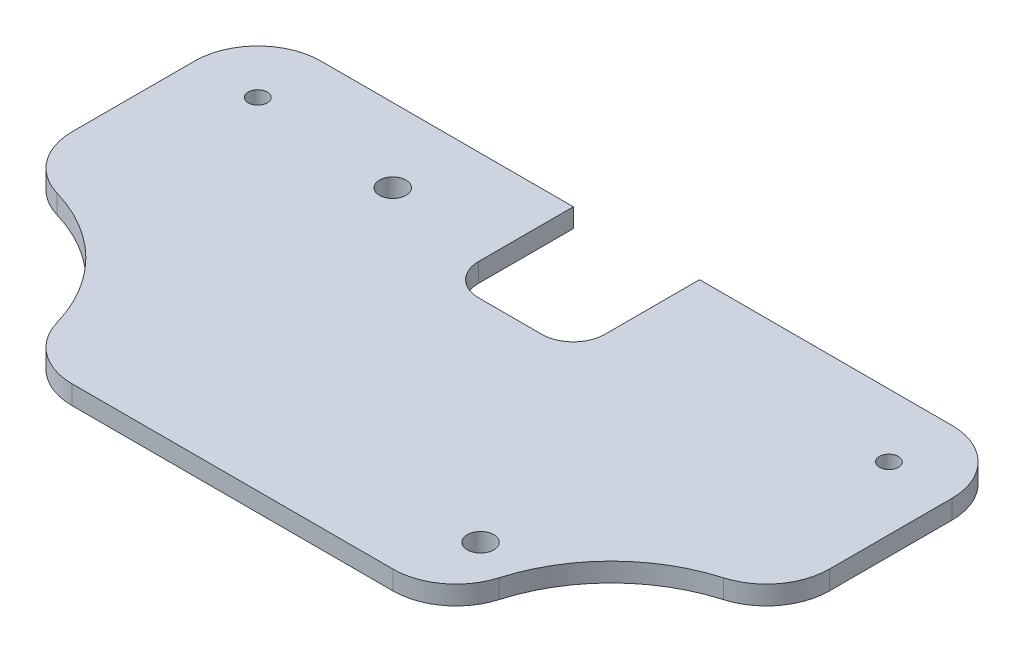
ISO-10303-21;
HEADER;
FILE_DESCRIPTION(('STEP AP214'),'2;1');
FILE_NAME('part.step','',(''),(''),'','','');
FILE_SCHEMA(('AUTOMOTIVE_DESIGN { 1 0 10303 214 1 1 1 1 }'));
ENDSEC;
DATA;
#1=APPLICATION_CONTEXT('core data for automotive mechanical design processes');
#2=APPLICATION_PROTOCOL_DEFINITION('international standard','automotive_design',2000,#1);
#3=PRODUCT_CONTEXT('',#1,'mechanical');
#4=PRODUCT('Part','Part','',(#3));
#5=PRODUCT_RELATED_PRODUCT_CATEGORY('part','',(#4));
#6=PRODUCT_DEFINITION_FORMATION('','',#4);
#7=PRODUCT_DEFINITION_CONTEXT('part definition',#1,'design');
#8=PRODUCT_DEFINITION('design','',#6,#7);
#9=PRODUCT_DEFINITION_SHAPE('','',#8);
#10=(LENGTH_UNIT() NAMED_UNIT(*) SI_UNIT(.MILLI.,.METRE.));
#11=(NAMED_UNIT(*) PLANE_ANGLE_UNIT() SI_UNIT($,.RADIAN.));
#12=(NAMED_UNIT(*) SI_UNIT($,.STERADIAN.) SOLID_ANGLE_UNIT());
#13=UNCERTAINTY_MEASURE_WITH_UNIT(LENGTH_MEASURE(1.E-05),#10,'distance_accuracy_value','');
#14=(GEOMETRIC_REPRESENTATION_CONTEXT(3) GLOBAL_UNCERTAINTY_ASSIGNED_CONTEXT((#13)) GLOBAL_UNIT_ASSIGNED_CONTEXT((#10,
#11,#12)) REPRESENTATION_CONTEXT('',''));
#15=CARTESIAN_POINT('',(0.,0.,0.));
#16=DIRECTION('',(0.,0.,1.));
#17=DIRECTION('',(1.,0.,0.));
#18=AXIS2_PLACEMENT_3D('',#15,#16,#17);
#19=CARTESIAN_POINT('',(-60.,3.,-32.));
#20=DIRECTION('',(0.,0.,1.));
#21=DIRECTION('',(1.,0.,0.));
#22=AXIS2_PLACEMENT_3D('',#19,#20,#21);
#23=PLANE('',#22);
#24=DIRECTION('',(-1.,0.,0.));
#25=VECTOR('',#24,1.);
#26=CARTESIAN_POINT('',(-60.,3.,-32.));
#27=LINE('',#26,#25);
#28=CARTESIAN_POINT('',(-9.99999999999999,3.,-32.));
#29=VERTEX_POINT('',#28);
#30=CARTESIAN_POINT('',(-50.,3.,-32.));
#31=VERTEX_POINT('',#30);
#32=EDGE_CURVE('E166',#29,#31,#27,.T.);
#33=ORIENTED_EDGE('',*,*,#32,.F.);
#34=DIRECTION('',(0.,-1.,0.));
#35=VECTOR('',#34,1.);
#36=CARTESIAN_POINT('',(-9.99999999999999,3.,-32.));
#37=LINE('',#36,#35);
#38=CARTESIAN_POINT('',(-9.99999999999999,0.,-32.));
#39=VERTEX_POINT('',#38);
#40=EDGE_CURVE('E178',#29,#39,#37,.T.);
#41=ORIENTED_EDGE('',*,*,#40,.T.);
#42=DIRECTION('',(-1.,0.,0.));
#43=VECTOR('',#42,1.);
#44=CARTESIAN_POINT('',(-60.,0.,-32.));
#45=LINE('',#44,#43);
#46=CARTESIAN_POINT('',(-50.,0.,-32.));
#47=VERTEX_POINT('',#46);
#48=EDGE_CURVE('E205',#39,#47,#45,.T.);
#49=ORIENTED_EDGE('',*,*,#48,.T.);
#50=DIRECTION('',(0.,-1.,0.));
#51=VECTOR('',#50,1.);
#52=CARTESIAN_POINT('',(-50.,3.,-32.));
#53=LINE('',#52,#51);
#54=EDGE_CURVE('E188',#47,#31,#53,.F.);
#55=ORIENTED_EDGE('',*,*,#54,.T.);
#56=EDGE_LOOP('',(#33,#41,#49,#55));
#57=FACE_BOUND('',#56,.T.);
#58=ADVANCED_FACE('F34',(#57),#23,.F.);
#59=CARTESIAN_POINT('',(60.,3.,32.));
#60=DIRECTION('',(-1.,0.,0.));
#61=DIRECTION('',(0.,0.,1.));
#62=AXIS2_PLACEMENT_3D('',#59,#60,#61);
#63=PLANE('',#62);
#64=DIRECTION('',(0.,0.,-1.));
#65=VECTOR('',#64,1.);
#66=CARTESIAN_POINT('',(60.,3.,32.));
#67=LINE('',#66,#65);
#68=CARTESIAN_POINT('',(60.,3.,-2.58323293158116));
#69=VERTEX_POINT('',#68);
#70=CARTESIAN_POINT('',(60.,3.,-22.));
#71=VERTEX_POINT('',#70);
#72=EDGE_CURVE('E191',#69,#71,#67,.T.);
#73=ORIENTED_EDGE('',*,*,#72,.F.);
#74=DIRECTION('',(0.,-1.,0.));
#75=VECTOR('',#74,1.);
#76=CARTESIAN_POINT('',(60.,3.,-2.58323293158116));
#77=LINE('',#76,#75);
#78=CARTESIAN_POINT('',(60.,0.,-2.58323293158116));
#79=VERTEX_POINT('',#78);
#80=EDGE_CURVE('E251',#69,#79,#77,.T.);
#81=ORIENTED_EDGE('',*,*,#80,.T.);
#82=DIRECTION('',(0.,0.,-1.));
#83=VECTOR('',#82,1.);
#84=CARTESIAN_POINT('',(60.,0.,32.));
#85=LINE('',#84,#83);
#86=CARTESIAN_POINT('',(60.,0.,-22.));
#87=VERTEX_POINT('',#86);
#88=EDGE_CURVE('E203',#79,#87,#85,.T.);
#89=ORIENTED_EDGE('',*,*,#88,.T.);
#90=DIRECTION('',(0.,-1.,0.));
#91=VECTOR('',#90,1.);
#92=CARTESIAN_POINT('',(60.,3.,-22.));
#93=LINE('',#92,#91);
#94=EDGE_CURVE('E225',#87,#71,#93,.F.);
#95=ORIENTED_EDGE('',*,*,#94,.T.);
#96=EDGE_LOOP('',(#73,#81,#89,#95));
#97=FACE_BOUND('',#96,.T.);
#98=ADVANCED_FACE('F347',(#97),#63,.F.);
#99=CARTESIAN_POINT('',(50.,0.,-32.));
#100=VERTEX_POINT('',#99);
#101=CARTESIAN_POINT('',(10.,0.,-32.));
#102=VERTEX_POINT('',#101);
#103=EDGE_CURVE('E207',#100,#102,#45,.T.);
#104=ORIENTED_EDGE('',*,*,#103,.T.);
#105=DIRECTION('',(0.,-1.,0.));
#106=VECTOR('',#105,1.);
#107=CARTESIAN_POINT('',(10.,3.,-32.));
#108=LINE('',#107,#106);
#109=CARTESIAN_POINT('',(10.,3.,-32.));
#110=VERTEX_POINT('',#109);
#111=EDGE_CURVE('E184',#110,#102,#108,.T.);
#112=ORIENTED_EDGE('',*,*,#111,.F.);
#113=CARTESIAN_POINT('',(50.,3.,-32.));
#114=VERTEX_POINT('',#113);
#115=EDGE_CURVE('E190',#114,#110,#27,.T.);
#116=ORIENTED_EDGE('',*,*,#115,.F.);
#117=DIRECTION('',(0.,-1.,0.));
#118=VECTOR('',#117,1.);
#119=CARTESIAN_POINT('',(50.,3.,-32.));
#120=LINE('',#119,#118);
#121=EDGE_CURVE('E216',#114,#100,#120,.T.);
#122=ORIENTED_EDGE('',*,*,#121,.T.);
#123=EDGE_LOOP('',(#104,#112,#116,#122));
#124=FACE_BOUND('',#123,.T.);
#125=ADVANCED_FACE('F349',(#124),#23,.F.);
#126=CARTESIAN_POINT('',(-60.,3.,32.));
#127=DIRECTION('',(1.,0.,0.));
#128=DIRECTION('',(0.,0.,-1.));
#129=AXIS2_PLACEMENT_3D('',#126,#127,#128);
#130=PLANE('',#129);
#131=DIRECTION('',(0.,0.,1.));
#132=VECTOR('',#131,1.);
#133=CARTESIAN_POINT('',(-60.,0.,32.));
#134=LINE('',#133,#132);
#135=CARTESIAN_POINT('',(-60.,0.,-22.));
#136=VERTEX_POINT('',#135);
#137=CARTESIAN_POINT('',(-60.,0.,-2.58323293158116));
#138=VERTEX_POINT('',#137);
#139=EDGE_CURVE('E210',#136,#138,#134,.T.);
#140=ORIENTED_EDGE('',*,*,#139,.T.);
#141=DIRECTION('',(0.,-1.,0.));
#142=VECTOR('',#141,1.);
#143=CARTESIAN_POINT('',(-60.,3.,-2.58323293158116));
#144=LINE('',#143,#142);
#145=CARTESIAN_POINT('',(-60.,3.,-2.58323293158116));
#146=VERTEX_POINT('',#145);
#147=EDGE_CURVE('E266',#138,#146,#144,.F.);
#148=ORIENTED_EDGE('',*,*,#147,.T.);
#149=DIRECTION('',(0.,0.,1.));
#150=VECTOR('',#149,1.);
#151=CARTESIAN_POINT('',(-60.,3.,32.));
#152=LINE('',#151,#150);
#153=CARTESIAN_POINT('',(-60.,3.,-22.));
#154=VERTEX_POINT('',#153);
#155=EDGE_CURVE('E194',#154,#146,#152,.T.);
#156=ORIENTED_EDGE('',*,*,#155,.F.);
#157=DIRECTION('',(0.,-1.,0.));
#158=VECTOR('',#157,1.);
#159=CARTESIAN_POINT('',(-60.,3.,-22.));
#160=LINE('',#159,#158);
#161=EDGE_CURVE('E232',#154,#136,#160,.T.);
#162=ORIENTED_EDGE('',*,*,#161,.T.);
#163=EDGE_LOOP('',(#140,#148,#156,#162));
#164=FACE_BOUND('',#163,.T.);
#165=ADVANCED_FACE('F341',(#164),#130,.F.);
#166=CARTESIAN_POINT('',(-60.,3.,32.));
#167=DIRECTION('',(0.,0.,-1.));
#168=DIRECTION('',(-1.,0.,0.));
#169=AXIS2_PLACEMENT_3D('',#166,#167,#168);
#170=PLANE('',#169);
#171=DIRECTION('',(1.,0.,0.));
#172=VECTOR('',#171,1.);
#173=CARTESIAN_POINT('',(-60.,0.,32.));
#174=LINE('',#173,#172);
#175=CARTESIAN_POINT('',(-25.4167670684188,0.,32.));
#176=VERTEX_POINT('',#175);
#177=CARTESIAN_POINT('',(25.4167670684188,0.,32.));
#178=VERTEX_POINT('',#177);
#179=EDGE_CURVE('E195',#176,#178,#174,.T.);
#180=ORIENTED_EDGE('',*,*,#179,.T.);
#181=DIRECTION('',(0.,-1.,0.));
#182=VECTOR('',#181,1.);
#183=CARTESIAN_POINT('',(25.4167670684188,3.,32.));
#184=LINE('',#183,#182);
#185=CARTESIAN_POINT('',(25.4167670684188,3.,32.));
#186=VERTEX_POINT('',#185);
#187=EDGE_CURVE('E274',#178,#186,#184,.F.);
#188=ORIENTED_EDGE('',*,*,#187,.T.);
#189=DIRECTION('',(1.,0.,0.));
#190=VECTOR('',#189,1.);
#191=CARTESIAN_POINT('',(-60.,3.,32.));
#192=LINE('',#191,#190);
#193=CARTESIAN_POINT('',(-25.4167670684188,3.,32.));
#194=VERTEX_POINT('',#193);
#195=EDGE_CURVE('E201',#194,#186,#192,.T.);
#196=ORIENTED_EDGE('',*,*,#195,.F.);
#197=DIRECTION('',(0.,-1.,0.));
#198=VECTOR('',#197,1.);
#199=CARTESIAN_POINT('',(-25.4167670684188,3.,32.));
#200=LINE('',#199,#198);
#201=EDGE_CURVE('E271',#194,#176,#200,.T.);
#202=ORIENTED_EDGE('',*,*,#201,.T.);
#203=EDGE_LOOP('',(#180,#188,#196,#202));
#204=FACE_BOUND('',#203,.T.);
#205=ADVANCED_FACE('F331',(#204),#170,.F.);
#206=CARTESIAN_POINT('',(0.,3.,0.));
#207=DIRECTION('',(0.,-1.,0.));
#208=DIRECTION('',(0.,0.,-1.));
#209=AXIS2_PLACEMENT_3D('',#206,#207,#208);
#210=PLANE('',#209);
#211=CARTESIAN_POINT('',(-26.921391454817,3.,-20.3095932567179));
#212=DIRECTION('',(0.,1.,0.));
#213=DIRECTION('',(0.,0.,1.));
#214=AXIS2_PLACEMENT_3D('',#211,#212,#213);
#215=CIRCLE('',#214,2.09999999999999);
#216=CARTESIAN_POINT('',(-26.921391454817,3.,-18.2095932567179));
#217=VERTEX_POINT('',#216);
#218=EDGE_CURVE('E285',#217,#217,#215,.T.);
#219=ORIENTED_EDGE('',*,*,#218,.F.);
#220=EDGE_LOOP('',(#219));
#221=FACE_BOUND('',#220,.T.);
#222=CARTESIAN_POINT('',(28.6833041627338,3.,21.3841451853975));
#223=DIRECTION('',(0.,1.,0.));
#224=DIRECTION('',(0.,0.,1.));
#225=AXIS2_PLACEMENT_3D('',#222,#223,#224);
#226=CIRCLE('',#225,2.09999999999999);
#227=CARTESIAN_POINT('',(28.6833041627338,3.,23.4841451853975));
#228=VERTEX_POINT('',#227);
#229=EDGE_CURVE('E291',#228,#228,#226,.T.);
#230=ORIENTED_EDGE('',*,*,#229,.F.);
#231=EDGE_LOOP('',(#230));
#232=FACE_BOUND('',#231,.T.);
#233=CARTESIAN_POINT('',(-50.,3.,-22.));
#234=DIRECTION('',(0.,1.,0.));
#235=DIRECTION('',(0.,0.,1.));
#236=AXIS2_PLACEMENT_3D('',#233,#234,#235);
#237=CIRCLE('',#236,1.5);
#238=CARTESIAN_POINT('',(-50.,3.,-20.5));
#239=VERTEX_POINT('',#238);
#240=EDGE_CURVE('E319',#239,#239,#237,.T.);
#241=ORIENTED_EDGE('',*,*,#240,.F.);
#242=EDGE_LOOP('',(#241));
#243=FACE_BOUND('',#242,.T.);
#244=CARTESIAN_POINT('',(50.,3.,-22.));
#245=DIRECTION('',(0.,1.,0.));
#246=DIRECTION('',(0.,0.,-1.));
#247=AXIS2_PLACEMENT_3D('',#244,#245,#246);
#248=CIRCLE('',#247,1.5);
#249=CARTESIAN_POINT('',(50.,3.,-23.5));
#250=VERTEX_POINT('',#249);
#251=EDGE_CURVE('E315',#250,#250,#248,.T.);
#252=ORIENTED_EDGE('',*,*,#251,.F.);
#253=EDGE_LOOP('',(#252));
#254=FACE_BOUND('',#253,.T.);
#255=ORIENTED_EDGE('',*,*,#195,.T.);
#256=CARTESIAN_POINT('',(25.4167670684188,3.,22.));
#257=DIRECTION('',(0.,-1.,0.));
#258=DIRECTION('',(0.,0.,-1.));
#259=AXIS2_PLACEMENT_3D('',#256,#257,#258);
#260=CIRCLE('',#259,10.);
#261=CARTESIAN_POINT('',(35.0232206605247,3.,24.7777777777778));
#262=VERTEX_POINT('',#261);
#263=EDGE_CURVE('E279',#186,#262,#260,.F.);
#264=ORIENTED_EDGE('',*,*,#263,.T.);
#265=CARTESIAN_POINT('',(60.,3.,32.));
#266=DIRECTION('',(0.,-1.,0.));
#267=DIRECTION('',(0.,0.,1.));
#268=AXIS2_PLACEMENT_3D('',#265,#266,#267);
#269=CIRCLE('',#268,26.);
#270=CARTESIAN_POINT('',(52.7777777777778,3.,7.02322066052472));
#271=VERTEX_POINT('',#270);
#272=EDGE_CURVE('E303',#262,#271,#269,.T.);
#273=ORIENTED_EDGE('',*,*,#272,.T.);
#274=CARTESIAN_POINT('',(50.,3.,-2.58323293158116));
#275=DIRECTION('',(0.,-1.,0.));
#276=DIRECTION('',(0.,0.,-1.));
#277=AXIS2_PLACEMENT_3D('',#274,#275,#276);
#278=CIRCLE('',#277,10.);
#279=EDGE_CURVE('E264',#271,#69,#278,.F.);
#280=ORIENTED_EDGE('',*,*,#279,.T.);
#281=ORIENTED_EDGE('',*,*,#72,.T.);
#282=CARTESIAN_POINT('',(50.,3.,-22.));
#283=DIRECTION('',(0.,-1.,0.));
#284=DIRECTION('',(0.,0.,-1.));
#285=AXIS2_PLACEMENT_3D('',#282,#283,#284);
#286=CIRCLE('',#285,10.);
#287=EDGE_CURVE('E230',#71,#114,#286,.F.);
#288=ORIENTED_EDGE('',*,*,#287,.T.);
#289=ORIENTED_EDGE('',*,*,#115,.T.);
#290=DIRECTION('',(0.,0.,1.));
#291=VECTOR('',#290,1.);
#292=CARTESIAN_POINT('',(10.,3.,-32.));
#293=LINE('',#292,#291);
#294=CARTESIAN_POINT('',(10.,3.,-17.));
#295=VERTEX_POINT('',#294);
#296=EDGE_CURVE('E174',#110,#295,#293,.T.);
#297=ORIENTED_EDGE('',*,*,#296,.T.);
#298=CARTESIAN_POINT('',(5.00000000000001,3.,-17.));
#299=DIRECTION('',(0.,-1.,0.));
#300=DIRECTION('',(0.,0.,-1.));
#301=AXIS2_PLACEMENT_3D('',#298,#299,#300);
#302=CIRCLE('',#301,5.);
#303=CARTESIAN_POINT('',(5.00000000000001,3.,-12.));
#304=VERTEX_POINT('',#303);
#305=EDGE_CURVE('E246',#295,#304,#302,.T.);
#306=ORIENTED_EDGE('',*,*,#305,.T.);
#307=DIRECTION('',(-1.,0.,0.));
#308=VECTOR('',#307,1.);
#309=CARTESIAN_POINT('',(-10.,3.,-12.));
#310=LINE('',#309,#308);
#311=CARTESIAN_POINT('',(-5.,3.,-12.));
#312=VERTEX_POINT('',#311);
#313=EDGE_CURVE('E185',#304,#312,#310,.T.);
#314=ORIENTED_EDGE('',*,*,#313,.T.);
#315=CARTESIAN_POINT('',(-5.,3.,-17.));
#316=DIRECTION('',(0.,-1.,0.));
#317=DIRECTION('',(0.,0.,-1.));
#318=AXIS2_PLACEMENT_3D('',#315,#316,#317);
#319=CIRCLE('',#318,5.);
#320=CARTESIAN_POINT('',(-10.,3.,-17.));
#321=VERTEX_POINT('',#320);
#322=EDGE_CURVE('E170',#312,#321,#319,.T.);
#323=ORIENTED_EDGE('',*,*,#322,.T.);
#324=DIRECTION('',(0.,0.,-1.));
#325=VECTOR('',#324,1.);
#326=CARTESIAN_POINT('',(-9.99999999999999,3.,-32.));
#327=LINE('',#326,#325);
#328=EDGE_CURVE('E161',#321,#29,#327,.T.);
#329=ORIENTED_EDGE('',*,*,#328,.T.);
#330=ORIENTED_EDGE('',*,*,#32,.T.);
#331=CARTESIAN_POINT('',(-50.,3.,-22.));
#332=DIRECTION('',(0.,-1.,0.));
#333=DIRECTION('',(0.,0.,-1.));
#334=AXIS2_PLACEMENT_3D('',#331,#332,#333);
#335=CIRCLE('',#334,10.);
#336=EDGE_CURVE('E228',#31,#154,#335,.F.);
#337=ORIENTED_EDGE('',*,*,#336,.T.);
#338=ORIENTED_EDGE('',*,*,#155,.T.);
#339=CARTESIAN_POINT('',(-50.,3.,-2.58323293158116));
#340=DIRECTION('',(0.,-1.,0.));
#341=DIRECTION('',(0.,0.,-1.));
#342=AXIS2_PLACEMENT_3D('',#339,#340,#341);
#343=CIRCLE('',#342,10.);
#344=CARTESIAN_POINT('',(-52.7777777777778,3.,7.02322066052472));
#345=VERTEX_POINT('',#344);
#346=EDGE_CURVE('E262',#146,#345,#343,.F.);
#347=ORIENTED_EDGE('',*,*,#346,.T.);
#348=CARTESIAN_POINT('',(-60.,3.,32.));
#349=DIRECTION('',(0.,-1.,0.));
#350=DIRECTION('',(0.,0.,-1.));
#351=AXIS2_PLACEMENT_3D('',#348,#349,#350);
#352=CIRCLE('',#351,26.);
#353=CARTESIAN_POINT('',(-35.0232206605247,3.,24.7777777777778));
#354=VERTEX_POINT('',#353);
#355=EDGE_CURVE('E298',#345,#354,#352,.T.);
#356=ORIENTED_EDGE('',*,*,#355,.T.);
#357=CARTESIAN_POINT('',(-25.4167670684188,3.,22.));
#358=DIRECTION('',(0.,-1.,0.));
#359=DIRECTION('',(0.,0.,-1.));
#360=AXIS2_PLACEMENT_3D('',#357,#358,#359);
#361=CIRCLE('',#360,10.);
#362=EDGE_CURVE('E277',#354,#194,#361,.F.);
#363=ORIENTED_EDGE('',*,*,#362,.T.);
#364=EDGE_LOOP('',(#255,#264,#273,#280,#281,#288,#289,#297,#306,#314,#323,#329,#330,#337,#338,
#347,#356,#363));
#365=FACE_BOUND('',#364,.T.);
#366=ADVANCED_FACE('F164',(#221,#232,#243,#254,#365),#210,.F.);
#367=CARTESIAN_POINT('',(0.,0.,0.));
#368=DIRECTION('',(0.,-1.,0.));
#369=DIRECTION('',(0.,0.,-1.));
#370=AXIS2_PLACEMENT_3D('',#367,#368,#369);
#371=PLANE('',#370);
#372=CARTESIAN_POINT('',(-26.921391454817,0.,-20.3095932567179));
#373=DIRECTION('',(0.,-1.,0.));
#374=DIRECTION('',(0.,0.,-1.));
#375=AXIS2_PLACEMENT_3D('',#372,#373,#374);
#376=CIRCLE('',#375,2.09999999999999);
#377=CARTESIAN_POINT('',(-26.921391454817,0.,-22.4095932567179));
#378=VERTEX_POINT('',#377);
#379=EDGE_CURVE('E38',#378,#378,#376,.T.);
#380=ORIENTED_EDGE('',*,*,#379,.F.);
#381=EDGE_LOOP('',(#380));
#382=FACE_BOUND('',#381,.T.);
#383=CARTESIAN_POINT('',(28.6833041627338,0.,21.3841451853975));
#384=DIRECTION('',(0.,-1.,0.));
#385=DIRECTION('',(0.,0.,-1.));
#386=AXIS2_PLACEMENT_3D('',#383,#384,#385);
#387=CIRCLE('',#386,2.09999999999999);
#388=CARTESIAN_POINT('',(28.6833041627338,0.,19.2841451853975));
#389=VERTEX_POINT('',#388);
#390=EDGE_CURVE('E283',#389,#389,#387,.T.);
#391=ORIENTED_EDGE('',*,*,#390,.F.);
#392=EDGE_LOOP('',(#391));
#393=FACE_BOUND('',#392,.T.);
#394=CARTESIAN_POINT('',(60.,0.,32.));
#395=DIRECTION('',(0.,-1.,0.));
#396=DIRECTION('',(0.,0.,1.));
#397=AXIS2_PLACEMENT_3D('',#394,#395,#396);
#398=CIRCLE('',#397,26.);
#399=CARTESIAN_POINT('',(35.0232206605247,0.,24.7777777777778));
#400=VERTEX_POINT('',#399);
#401=CARTESIAN_POINT('',(52.7777777777778,0.,7.02322066052472));
#402=VERTEX_POINT('',#401);
#403=EDGE_CURVE('E289',#400,#402,#398,.T.);
#404=ORIENTED_EDGE('',*,*,#403,.F.);
#405=CARTESIAN_POINT('',(25.4167670684188,0.,22.));
#406=DIRECTION('',(0.,-1.,0.));
#407=DIRECTION('',(0.,0.,-1.));
#408=AXIS2_PLACEMENT_3D('',#405,#406,#407);
#409=CIRCLE('',#408,10.);
#410=EDGE_CURVE('E43',#400,#178,#409,.T.);
#411=ORIENTED_EDGE('',*,*,#410,.T.);
#412=ORIENTED_EDGE('',*,*,#179,.F.);
#413=CARTESIAN_POINT('',(-25.4167670684188,0.,22.));
#414=DIRECTION('',(0.,-1.,0.));
#415=DIRECTION('',(0.,0.,-1.));
#416=AXIS2_PLACEMENT_3D('',#413,#414,#415);
#417=CIRCLE('',#416,10.);
#418=CARTESIAN_POINT('',(-35.0232206605247,0.,24.7777777777778));
#419=VERTEX_POINT('',#418);
#420=EDGE_CURVE('E51',#176,#419,#417,.T.);
#421=ORIENTED_EDGE('',*,*,#420,.T.);
#422=CARTESIAN_POINT('',(-60.,0.,32.));
#423=DIRECTION('',(0.,-1.,0.));
#424=DIRECTION('',(0.,0.,-1.));
#425=AXIS2_PLACEMENT_3D('',#422,#423,#424);
#426=CIRCLE('',#425,26.);
#427=CARTESIAN_POINT('',(-52.7777777777778,0.,7.02322066052472));
#428=VERTEX_POINT('',#427);
#429=EDGE_CURVE('E301',#428,#419,#426,.T.);
#430=ORIENTED_EDGE('',*,*,#429,.F.);
#431=CARTESIAN_POINT('',(-50.,0.,-2.58323293158116));
#432=DIRECTION('',(0.,-1.,0.));
#433=DIRECTION('',(0.,0.,-1.));
#434=AXIS2_PLACEMENT_3D('',#431,#432,#433);
#435=CIRCLE('',#434,10.);
#436=EDGE_CURVE('E254',#428,#138,#435,.T.);
#437=ORIENTED_EDGE('',*,*,#436,.T.);
#438=ORIENTED_EDGE('',*,*,#139,.F.);
#439=CARTESIAN_POINT('',(-50.,0.,-22.));
#440=DIRECTION('',(0.,-1.,0.));
#441=DIRECTION('',(0.,0.,-1.));
#442=AXIS2_PLACEMENT_3D('',#439,#440,#441);
#443=CIRCLE('',#442,10.);
#444=EDGE_CURVE('E219',#136,#47,#443,.T.);
#445=ORIENTED_EDGE('',*,*,#444,.T.);
#446=ORIENTED_EDGE('',*,*,#48,.F.);
#447=DIRECTION('',(0.,0.,-1.));
#448=VECTOR('',#447,1.);
#449=CARTESIAN_POINT('',(-9.99999999999999,0.,-32.));
#450=LINE('',#449,#448);
#451=CARTESIAN_POINT('',(-10.,0.,-17.));
#452=VERTEX_POINT('',#451);
#453=EDGE_CURVE('E181',#452,#39,#450,.T.);
#454=ORIENTED_EDGE('',*,*,#453,.F.);
#455=CARTESIAN_POINT('',(-5.,0.,-17.));
#456=DIRECTION('',(0.,-1.,0.));
#457=DIRECTION('',(0.,0.,-1.));
#458=AXIS2_PLACEMENT_3D('',#455,#456,#457);
#459=CIRCLE('',#458,5.);
#460=CARTESIAN_POINT('',(-5.,0.,-12.));
#461=VERTEX_POINT('',#460);
#462=EDGE_CURVE('E248',#452,#461,#459,.F.);
#463=ORIENTED_EDGE('',*,*,#462,.T.);
#464=DIRECTION('',(-1.,0.,0.));
#465=VECTOR('',#464,1.);
#466=CARTESIAN_POINT('',(-10.,0.,-12.));
#467=LINE('',#466,#465);
#468=CARTESIAN_POINT('',(5.00000000000001,0.,-12.));
#469=VERTEX_POINT('',#468);
#470=EDGE_CURVE('E175',#469,#461,#467,.T.);
#471=ORIENTED_EDGE('',*,*,#470,.F.);
#472=CARTESIAN_POINT('',(5.00000000000001,0.,-17.));
#473=DIRECTION('',(0.,-1.,0.));
#474=DIRECTION('',(0.,0.,-1.));
#475=AXIS2_PLACEMENT_3D('',#472,#473,#474);
#476=CIRCLE('',#475,5.);
#477=CARTESIAN_POINT('',(10.,0.,-17.));
#478=VERTEX_POINT('',#477);
#479=EDGE_CURVE('E244',#469,#478,#476,.F.);
#480=ORIENTED_EDGE('',*,*,#479,.T.);
#481=DIRECTION('',(0.,0.,1.));
#482=VECTOR('',#481,1.);
#483=CARTESIAN_POINT('',(10.,0.,-32.));
#484=LINE('',#483,#482);
#485=EDGE_CURVE('E310',#102,#478,#484,.T.);
#486=ORIENTED_EDGE('',*,*,#485,.F.);
#487=ORIENTED_EDGE('',*,*,#103,.F.);
#488=CARTESIAN_POINT('',(50.,0.,-22.));
#489=DIRECTION('',(0.,-1.,0.));
#490=DIRECTION('',(0.,0.,-1.));
#491=AXIS2_PLACEMENT_3D('',#488,#489,#490);
#492=CIRCLE('',#491,10.);
#493=EDGE_CURVE('E222',#100,#87,#492,.T.);
#494=ORIENTED_EDGE('',*,*,#493,.T.);
#495=ORIENTED_EDGE('',*,*,#88,.F.);
#496=CARTESIAN_POINT('',(50.,0.,-2.58323293158116));
#497=DIRECTION('',(0.,-1.,0.));
#498=DIRECTION('',(0.,0.,-1.));
#499=AXIS2_PLACEMENT_3D('',#496,#497,#498);
#500=CIRCLE('',#499,10.);
#501=EDGE_CURVE('E256',#79,#402,#500,.T.);
#502=ORIENTED_EDGE('',*,*,#501,.T.);
#503=EDGE_LOOP('',(#404,#411,#412,#421,#430,#437,#438,#445,#446,#454,#463,#471,#480,#486,#487,
#494,#495,#502));
#504=FACE_BOUND('',#503,.T.);
#505=CARTESIAN_POINT('',(-50.,0.,-22.));
#506=DIRECTION('',(0.,1.,0.));
#507=DIRECTION('',(0.,0.,1.));
#508=AXIS2_PLACEMENT_3D('',#505,#506,#507);
#509=CIRCLE('',#508,1.5);
#510=CARTESIAN_POINT('',(-50.,0.,-20.5));
#511=VERTEX_POINT('',#510);
#512=EDGE_CURVE('E206',#511,#511,#509,.T.);
#513=ORIENTED_EDGE('',*,*,#512,.T.);
#514=EDGE_LOOP('',(#513));
#515=FACE_BOUND('',#514,.T.);
#516=CARTESIAN_POINT('',(50.,0.,-22.));
#517=DIRECTION('',(0.,1.,0.));
#518=DIRECTION('',(0.,0.,-1.));
#519=AXIS2_PLACEMENT_3D('',#516,#517,#518);
#520=CIRCLE('',#519,1.5);
#521=CARTESIAN_POINT('',(50.,0.,-23.5));
#522=VERTEX_POINT('',#521);
#523=EDGE_CURVE('E322',#522,#522,#520,.T.);
#524=ORIENTED_EDGE('',*,*,#523,.T.);
#525=EDGE_LOOP('',(#524));
#526=FACE_BOUND('',#525,.T.);
#527=ADVANCED_FACE('F330',(#382,#393,#504,#515,#526),#371,.T.);
#528=CARTESIAN_POINT('',(50.,0.,-22.));
#529=DIRECTION('',(0.,1.,0.));
#530=DIRECTION('',(0.,0.,1.));
#531=AXIS2_PLACEMENT_3D('',#528,#529,#530);
#532=CYLINDRICAL_SURFACE('',#531,1.5);
#533=ORIENTED_EDGE('',*,*,#523,.F.);
#534=EDGE_LOOP('',(#533));
#535=FACE_BOUND('',#534,.T.);
#536=ORIENTED_EDGE('',*,*,#251,.T.);
#537=EDGE_LOOP('',(#536));
#538=FACE_BOUND('',#537,.T.);
#539=ADVANCED_FACE('F327',(#535,#538),#532,.F.);
#540=CARTESIAN_POINT('',(-50.,0.,-22.));
#541=DIRECTION('',(0.,1.,0.));
#542=DIRECTION('',(0.,0.,1.));
#543=AXIS2_PLACEMENT_3D('',#540,#541,#542);
#544=CYLINDRICAL_SURFACE('',#543,1.5);
#545=ORIENTED_EDGE('',*,*,#512,.F.);
#546=EDGE_LOOP('',(#545));
#547=FACE_BOUND('',#546,.T.);
#548=ORIENTED_EDGE('',*,*,#240,.T.);
#549=EDGE_LOOP('',(#548));
#550=FACE_BOUND('',#549,.T.);
#551=ADVANCED_FACE('F417',(#547,#550),#544,.F.);
#552=CARTESIAN_POINT('',(50.,3.,-22.));
#553=DIRECTION('',(0.,-1.,0.));
#554=DIRECTION('',(0.,0.,-1.));
#555=AXIS2_PLACEMENT_3D('',#552,#553,#554);
#556=CYLINDRICAL_SURFACE('',#555,10.);
#557=ORIENTED_EDGE('',*,*,#287,.F.);
#558=ORIENTED_EDGE('',*,*,#94,.F.);
#559=ORIENTED_EDGE('',*,*,#493,.F.);
#560=ORIENTED_EDGE('',*,*,#121,.F.);
#561=EDGE_LOOP('',(#557,#558,#559,#560));
#562=FACE_BOUND('',#561,.T.);
#563=ADVANCED_FACE('F415',(#562),#556,.T.);
#564=CARTESIAN_POINT('',(-50.,3.,-22.));
#565=DIRECTION('',(0.,-1.,0.));
#566=DIRECTION('',(0.,0.,-1.));
#567=AXIS2_PLACEMENT_3D('',#564,#565,#566);
#568=CYLINDRICAL_SURFACE('',#567,10.);
#569=ORIENTED_EDGE('',*,*,#336,.F.);
#570=ORIENTED_EDGE('',*,*,#54,.F.);
#571=ORIENTED_EDGE('',*,*,#444,.F.);
#572=ORIENTED_EDGE('',*,*,#161,.F.);
#573=EDGE_LOOP('',(#569,#570,#571,#572));
#574=FACE_BOUND('',#573,.T.);
#575=ADVANCED_FACE('F387',(#574),#568,.T.);
#576=CARTESIAN_POINT('',(-9.99999999999999,3.,-32.));
#577=DIRECTION('',(-1.,0.,0.));
#578=DIRECTION('',(0.,0.,1.));
#579=AXIS2_PLACEMENT_3D('',#576,#577,#578);
#580=PLANE('',#579);
#581=ORIENTED_EDGE('',*,*,#328,.F.);
#582=DIRECTION('',(0.,-1.,0.));
#583=VECTOR('',#582,1.);
#584=CARTESIAN_POINT('',(-10.,0.,-17.));
#585=LINE('',#584,#583);
#586=EDGE_CURVE('E242',#321,#452,#585,.T.);
#587=ORIENTED_EDGE('',*,*,#586,.T.);
#588=ORIENTED_EDGE('',*,*,#453,.T.);
#589=ORIENTED_EDGE('',*,*,#40,.F.);
#590=EDGE_LOOP('',(#581,#587,#588,#589));
#591=FACE_BOUND('',#590,.T.);
#592=ADVANCED_FACE('F179',(#591),#580,.F.);
#593=CARTESIAN_POINT('',(-10.,3.,-12.));
#594=DIRECTION('',(0.,0.,1.));
#595=DIRECTION('',(1.,0.,0.));
#596=AXIS2_PLACEMENT_3D('',#593,#594,#595);
#597=PLANE('',#596);
#598=ORIENTED_EDGE('',*,*,#313,.F.);
#599=DIRECTION('',(0.,-1.,0.));
#600=VECTOR('',#599,1.);
#601=CARTESIAN_POINT('',(5.00000000000001,0.,-12.));
#602=LINE('',#601,#600);
#603=EDGE_CURVE('E237',#304,#469,#602,.T.);
#604=ORIENTED_EDGE('',*,*,#603,.T.);
#605=ORIENTED_EDGE('',*,*,#470,.T.);
#606=DIRECTION('',(0.,-1.,0.));
#607=VECTOR('',#606,1.);
#608=CARTESIAN_POINT('',(-5.,3.,-12.));
#609=LINE('',#608,#607);
#610=EDGE_CURVE('E235',#461,#312,#609,.F.);
#611=ORIENTED_EDGE('',*,*,#610,.T.);
#612=EDGE_LOOP('',(#598,#604,#605,#611));
#613=FACE_BOUND('',#612,.T.);
#614=ADVANCED_FACE('F380',(#613),#597,.F.);
#615=CARTESIAN_POINT('',(10.,3.,-32.));
#616=DIRECTION('',(1.,0.,0.));
#617=DIRECTION('',(0.,0.,-1.));
#618=AXIS2_PLACEMENT_3D('',#615,#616,#617);
#619=PLANE('',#618);
#620=ORIENTED_EDGE('',*,*,#485,.T.);
#621=DIRECTION('',(0.,-1.,0.));
#622=VECTOR('',#621,1.);
#623=CARTESIAN_POINT('',(10.,3.,-17.));
#624=LINE('',#623,#622);
#625=EDGE_CURVE('E240',#478,#295,#624,.F.);
#626=ORIENTED_EDGE('',*,*,#625,.T.);
#627=ORIENTED_EDGE('',*,*,#296,.F.);
#628=ORIENTED_EDGE('',*,*,#111,.T.);
#629=EDGE_LOOP('',(#620,#626,#627,#628));
#630=FACE_BOUND('',#629,.T.);
#631=ADVANCED_FACE('F373',(#630),#619,.F.);
#632=CARTESIAN_POINT('',(60.,3.,32.));
#633=DIRECTION('',(0.,-1.,0.));
#634=DIRECTION('',(0.,0.,-1.));
#635=AXIS2_PLACEMENT_3D('',#632,#633,#634);
#636=CYLINDRICAL_SURFACE('',#635,26.);
#637=ORIENTED_EDGE('',*,*,#272,.F.);
#638=DIRECTION('',(0.,-1.,0.));
#639=VECTOR('',#638,1.);
#640=CARTESIAN_POINT('',(35.0232206605247,3.,24.7777777777778));
#641=LINE('',#640,#639);
#642=EDGE_CURVE('E59',#262,#400,#641,.T.);
#643=ORIENTED_EDGE('',*,*,#642,.T.);
#644=ORIENTED_EDGE('',*,*,#403,.T.);
#645=DIRECTION('',(0.,-1.,0.));
#646=VECTOR('',#645,1.);
#647=CARTESIAN_POINT('',(52.7777777777778,3.,7.02322066052472));
#648=LINE('',#647,#646);
#649=EDGE_CURVE('E259',#402,#271,#648,.F.);
#650=ORIENTED_EDGE('',*,*,#649,.T.);
#651=EDGE_LOOP('',(#637,#643,#644,#650));
#652=FACE_BOUND('',#651,.T.);
#653=ADVANCED_FACE('F406',(#652),#636,.F.);
#654=CARTESIAN_POINT('',(-60.,3.,32.));
#655=DIRECTION('',(0.,-1.,0.));
#656=DIRECTION('',(0.,0.,-1.));
#657=AXIS2_PLACEMENT_3D('',#654,#655,#656);
#658=CYLINDRICAL_SURFACE('',#657,26.);
#659=ORIENTED_EDGE('',*,*,#429,.T.);
#660=DIRECTION('',(0.,-1.,0.));
#661=VECTOR('',#660,1.);
#662=CARTESIAN_POINT('',(-35.0232206605247,3.,24.7777777777778));
#663=LINE('',#662,#661);
#664=EDGE_CURVE('E11',#419,#354,#663,.F.);
#665=ORIENTED_EDGE('',*,*,#664,.T.);
#666=ORIENTED_EDGE('',*,*,#355,.F.);
#667=DIRECTION('',(0.,-1.,0.));
#668=VECTOR('',#667,1.);
#669=CARTESIAN_POINT('',(-52.7777777777778,3.,7.02322066052472));
#670=LINE('',#669,#668);
#671=EDGE_CURVE('E269',#345,#428,#670,.T.);
#672=ORIENTED_EDGE('',*,*,#671,.T.);
#673=EDGE_LOOP('',(#659,#665,#666,#672));
#674=FACE_BOUND('',#673,.T.);
#675=ADVANCED_FACE('F397',(#674),#658,.F.);
#676=CARTESIAN_POINT('',(5.00000000000001,3.,-17.));
#677=DIRECTION('',(0.,1.,0.));
#678=DIRECTION('',(0.,0.,1.));
#679=AXIS2_PLACEMENT_3D('',#676,#677,#678);
#680=CYLINDRICAL_SURFACE('',#679,5.);
#681=ORIENTED_EDGE('',*,*,#305,.F.);
#682=ORIENTED_EDGE('',*,*,#625,.F.);
#683=ORIENTED_EDGE('',*,*,#479,.F.);
#684=ORIENTED_EDGE('',*,*,#603,.F.);
#685=EDGE_LOOP('',(#681,#682,#683,#684));
#686=FACE_BOUND('',#685,.T.);
#687=ADVANCED_FACE('F376',(#686),#680,.F.);
#688=CARTESIAN_POINT('',(-5.,3.,-17.));
#689=DIRECTION('',(0.,1.,0.));
#690=DIRECTION('',(0.,0.,1.));
#691=AXIS2_PLACEMENT_3D('',#688,#689,#690);
#692=CYLINDRICAL_SURFACE('',#691,5.);
#693=ORIENTED_EDGE('',*,*,#322,.F.);
#694=ORIENTED_EDGE('',*,*,#610,.F.);
#695=ORIENTED_EDGE('',*,*,#462,.F.);
#696=ORIENTED_EDGE('',*,*,#586,.F.);
#697=EDGE_LOOP('',(#693,#694,#695,#696));
#698=FACE_BOUND('',#697,.T.);
#699=ADVANCED_FACE('F383',(#698),#692,.F.);
#700=CARTESIAN_POINT('',(50.,3.,-2.58323293158116));
#701=DIRECTION('',(0.,-1.,0.));
#702=DIRECTION('',(0.,0.,-1.));
#703=AXIS2_PLACEMENT_3D('',#700,#701,#702);
#704=CYLINDRICAL_SURFACE('',#703,10.);
#705=ORIENTED_EDGE('',*,*,#279,.F.);
#706=ORIENTED_EDGE('',*,*,#649,.F.);
#707=ORIENTED_EDGE('',*,*,#501,.F.);
#708=ORIENTED_EDGE('',*,*,#80,.F.);
#709=EDGE_LOOP('',(#705,#706,#707,#708));
#710=FACE_BOUND('',#709,.T.);
#711=ADVANCED_FACE('F411',(#710),#704,.T.);
#712=CARTESIAN_POINT('',(-50.,3.,-2.58323293158116));
#713=DIRECTION('',(0.,-1.,0.));
#714=DIRECTION('',(0.,0.,-1.));
#715=AXIS2_PLACEMENT_3D('',#712,#713,#714);
#716=CYLINDRICAL_SURFACE('',#715,10.);
#717=ORIENTED_EDGE('',*,*,#436,.F.);
#718=ORIENTED_EDGE('',*,*,#671,.F.);
#719=ORIENTED_EDGE('',*,*,#346,.F.);
#720=ORIENTED_EDGE('',*,*,#147,.F.);
#721=EDGE_LOOP('',(#717,#718,#719,#720));
#722=FACE_BOUND('',#721,.T.);
#723=ADVANCED_FACE('F392',(#722),#716,.T.);
#724=CARTESIAN_POINT('',(25.4167670684188,3.,22.));
#725=DIRECTION('',(0.,-1.,0.));
#726=DIRECTION('',(0.,0.,-1.));
#727=AXIS2_PLACEMENT_3D('',#724,#725,#726);
#728=CYLINDRICAL_SURFACE('',#727,10.);
#729=ORIENTED_EDGE('',*,*,#410,.F.);
#730=ORIENTED_EDGE('',*,*,#642,.F.);
#731=ORIENTED_EDGE('',*,*,#263,.F.);
#732=ORIENTED_EDGE('',*,*,#187,.F.);
#733=EDGE_LOOP('',(#729,#730,#731,#732));
#734=FACE_BOUND('',#733,.T.);
#735=ADVANCED_FACE('F405',(#734),#728,.T.);
#736=CARTESIAN_POINT('',(-25.4167670684188,3.,22.));
#737=DIRECTION('',(0.,-1.,0.));
#738=DIRECTION('',(0.,0.,-1.));
#739=AXIS2_PLACEMENT_3D('',#736,#737,#738);
#740=CYLINDRICAL_SURFACE('',#739,10.);
#741=ORIENTED_EDGE('',*,*,#362,.F.);
#742=ORIENTED_EDGE('',*,*,#664,.F.);
#743=ORIENTED_EDGE('',*,*,#420,.F.);
#744=ORIENTED_EDGE('',*,*,#201,.F.);
#745=EDGE_LOOP('',(#741,#742,#743,#744));
#746=FACE_BOUND('',#745,.T.);
#747=ADVANCED_FACE('F36',(#746),#740,.T.);
#748=CARTESIAN_POINT('',(28.6833041627338,-3.,21.3841451853975));
#749=DIRECTION('',(0.,1.,0.));
#750=DIRECTION('',(0.,0.,1.));
#751=AXIS2_PLACEMENT_3D('',#748,#749,#750);
#752=CYLINDRICAL_SURFACE('',#751,2.09999999999999);
#753=ORIENTED_EDGE('',*,*,#390,.T.);
#754=EDGE_LOOP('',(#753));
#755=FACE_BOUND('',#754,.T.);
#756=ORIENTED_EDGE('',*,*,#229,.T.);
#757=EDGE_LOOP('',(#756));
#758=FACE_BOUND('',#757,.T.);
#759=ADVANCED_FACE('F438',(#755,#758),#752,.F.);
#760=CARTESIAN_POINT('',(-26.921391454817,-3.,-20.3095932567179));
#761=DIRECTION('',(0.,1.,0.));
#762=DIRECTION('',(0.,0.,1.));
#763=AXIS2_PLACEMENT_3D('',#760,#761,#762);
#764=CYLINDRICAL_SURFACE('',#763,2.09999999999999);
#765=ORIENTED_EDGE('',*,*,#379,.T.);
#766=EDGE_LOOP('',(#765));
#767=FACE_BOUND('',#766,.T.);
#768=ORIENTED_EDGE('',*,*,#218,.T.);
#769=EDGE_LOOP('',(#768));
#770=FACE_BOUND('',#769,.T.);
#771=ADVANCED_FACE('F441',(#767,#770),#764,.F.);
#772=CLOSED_SHELL('',(#58,#98,#125,#165,#205,#366,#527,#539,#551,#563,#575,#592,#614,#631,#653,
#675,#687,#699,#711,#723,#735,#747,#759,#771));
#773=MANIFOLD_SOLID_BREP('B2',#772);
#774=ADVANCED_BREP_SHAPE_REPRESENTATION('',(#18,#773),#14);
#775=SHAPE_DEFINITION_REPRESENTATION(#9,#774);
ENDSEC;
END-ISO-10303-21;
